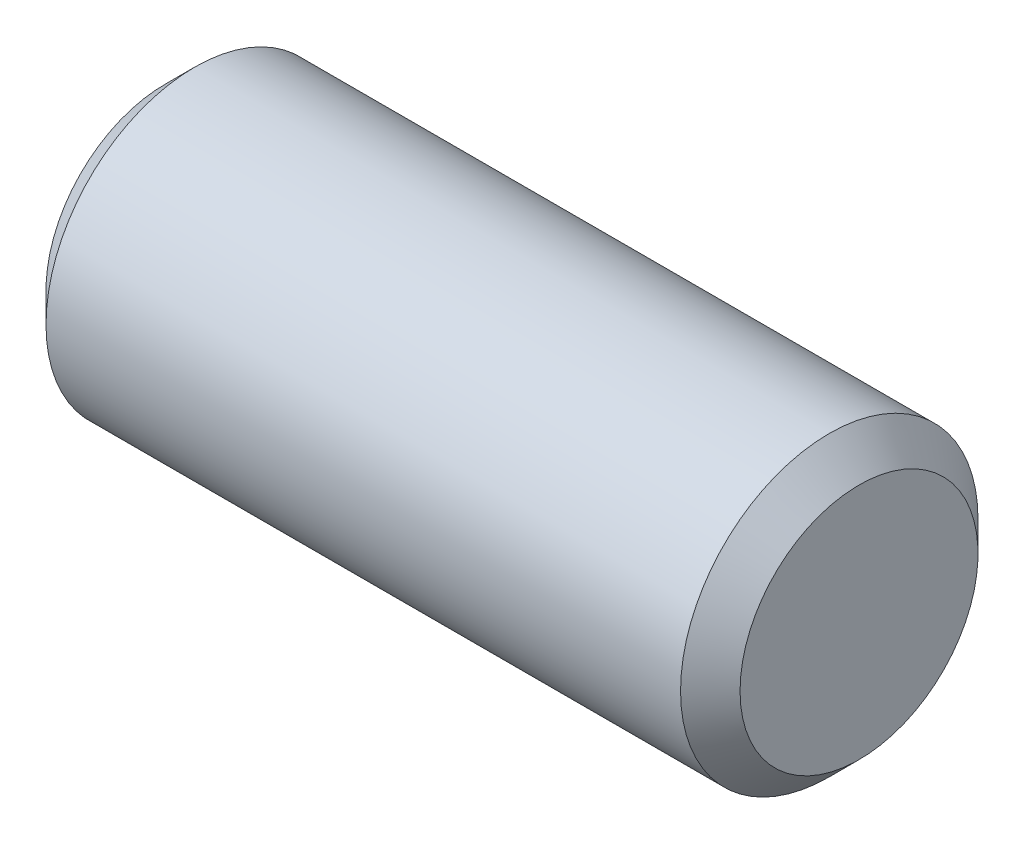
ISO-10303-21;
HEADER;
FILE_DESCRIPTION(('STEP AP214'),'2;1');
FILE_NAME('part.step','',(''),(''),'','','');
FILE_SCHEMA(('AUTOMOTIVE_DESIGN { 1 0 10303 214 1 1 1 1 }'));
ENDSEC;
DATA;
#1=APPLICATION_CONTEXT('core data for automotive mechanical design processes');
#2=APPLICATION_PROTOCOL_DEFINITION('international standard','automotive_design',2000,#1);
#3=PRODUCT_CONTEXT('',#1,'mechanical');
#4=PRODUCT('Part','Part','',(#3));
#5=PRODUCT_RELATED_PRODUCT_CATEGORY('part','',(#4));
#6=PRODUCT_DEFINITION_FORMATION('','',#4);
#7=PRODUCT_DEFINITION_CONTEXT('part definition',#1,'design');
#8=PRODUCT_DEFINITION('design','',#6,#7);
#9=PRODUCT_DEFINITION_SHAPE('','',#8);
#10=(LENGTH_UNIT() NAMED_UNIT(*) SI_UNIT(.MILLI.,.METRE.));
#11=(NAMED_UNIT(*) PLANE_ANGLE_UNIT() SI_UNIT($,.RADIAN.));
#12=(NAMED_UNIT(*) SI_UNIT($,.STERADIAN.) SOLID_ANGLE_UNIT());
#13=UNCERTAINTY_MEASURE_WITH_UNIT(LENGTH_MEASURE(1.E-05),#10,'distance_accuracy_value','');
#14=(GEOMETRIC_REPRESENTATION_CONTEXT(3) GLOBAL_UNCERTAINTY_ASSIGNED_CONTEXT((#13)) GLOBAL_UNIT_ASSIGNED_CONTEXT((#10,
#11,#12)) REPRESENTATION_CONTEXT('',''));
#15=CARTESIAN_POINT('',(0.,0.,0.));
#16=DIRECTION('',(0.,0.,1.));
#17=DIRECTION('',(1.,0.,0.));
#18=AXIS2_PLACEMENT_3D('',#15,#16,#17);
#19=CARTESIAN_POINT('',(-5.55625,0.,0.));
#20=DIRECTION('',(1.,0.,0.));
#21=DIRECTION('',(0.,0.,-1.));
#22=AXIS2_PLACEMENT_3D('',#19,#20,#21);
#23=CYLINDRICAL_SURFACE('',#22,2.38125);
#24=CARTESIAN_POINT('',(5.08,0.,0.));
#25=DIRECTION('',(1.,0.,0.));
#26=DIRECTION('',(0.,0.,-1.));
#27=AXIS2_PLACEMENT_3D('',#24,#25,#26);
#28=CIRCLE('',#27,2.38125);
#29=CARTESIAN_POINT('',(5.08,0.,2.38125));
#30=VERTEX_POINT('',#29);
#31=EDGE_CURVE('E42',#30,#30,#28,.F.);
#32=ORIENTED_EDGE('',*,*,#31,.T.);
#33=EDGE_LOOP('',(#32));
#34=FACE_BOUND('',#33,.T.);
#35=CARTESIAN_POINT('',(-5.08,0.,0.));
#36=DIRECTION('',(1.,0.,0.));
#37=DIRECTION('',(0.,0.,-1.));
#38=AXIS2_PLACEMENT_3D('',#35,#36,#37);
#39=CIRCLE('',#38,2.38125);
#40=CARTESIAN_POINT('',(-5.08,0.,-2.38125));
#41=VERTEX_POINT('',#40);
#42=EDGE_CURVE('E49',#41,#41,#39,.T.);
#43=ORIENTED_EDGE('',*,*,#42,.T.);
#44=EDGE_LOOP('',(#43));
#45=FACE_BOUND('',#44,.T.);
#46=ADVANCED_FACE('F34',(#34,#45),#23,.T.);
#47=CARTESIAN_POINT('',(-5.55625,0.,0.));
#48=DIRECTION('',(1.,0.,0.));
#49=DIRECTION('',(0.,0.,-1.));
#50=AXIS2_PLACEMENT_3D('',#47,#48,#49);
#51=PLANE('',#50);
#52=CARTESIAN_POINT('',(-5.55625,0.,0.));
#53=DIRECTION('',(1.,0.,0.));
#54=DIRECTION('',(0.,0.,-1.));
#55=AXIS2_PLACEMENT_3D('',#52,#53,#54);
#56=CIRCLE('',#55,1.905);
#57=CARTESIAN_POINT('',(-5.55625,0.,-1.905));
#58=VERTEX_POINT('',#57);
#59=EDGE_CURVE('E10',#58,#58,#56,.F.);
#60=ORIENTED_EDGE('',*,*,#59,.T.);
#61=EDGE_LOOP('',(#60));
#62=FACE_BOUND('',#61,.T.);
#63=ADVANCED_FACE('F69',(#62),#51,.F.);
#64=CARTESIAN_POINT('',(5.55625,0.,0.));
#65=DIRECTION('',(1.,0.,0.));
#66=DIRECTION('',(0.,0.,-1.));
#67=AXIS2_PLACEMENT_3D('',#64,#65,#66);
#68=PLANE('',#67);
#69=CARTESIAN_POINT('',(5.55625,0.,0.));
#70=DIRECTION('',(1.,0.,0.));
#71=DIRECTION('',(0.,0.,-1.));
#72=AXIS2_PLACEMENT_3D('',#69,#70,#71);
#73=CIRCLE('',#72,1.905);
#74=CARTESIAN_POINT('',(5.55625,0.,1.905));
#75=VERTEX_POINT('',#74);
#76=EDGE_CURVE('E53',#75,#75,#73,.T.);
#77=ORIENTED_EDGE('',*,*,#76,.T.);
#78=EDGE_LOOP('',(#77));
#79=FACE_BOUND('',#78,.T.);
#80=ADVANCED_FACE('F59',(#79),#68,.T.);
#81=CARTESIAN_POINT('',(5.55625,0.,0.));
#82=DIRECTION('',(-1.,0.,0.));
#83=DIRECTION('',(0.,0.,1.));
#84=AXIS2_PLACEMENT_3D('',#81,#82,#83);
#85=CONICAL_SURFACE('',#84,1.905,0.785398163397445);
#86=CARTESIAN_POINT('',(5.08,0.,2.38125));
#87=CARTESIAN_POINT('',(5.0849609375,0.,2.3762890625));
#88=CARTESIAN_POINT('',(5.089921875,0.,2.371328125));
#89=CARTESIAN_POINT('',(5.09984375,0.,2.36140625));
#90=CARTESIAN_POINT('',(5.1048046875,0.,2.3564453125));
#91=CARTESIAN_POINT('',(5.1147265625,0.,2.3465234375));
#92=CARTESIAN_POINT('',(5.1196875,0.,2.3415625));
#93=CARTESIAN_POINT('',(5.129609375,0.,2.331640625));
#94=CARTESIAN_POINT('',(5.1345703125,0.,2.3266796875));
#95=CARTESIAN_POINT('',(5.1444921875,0.,2.3167578125));
#96=CARTESIAN_POINT('',(5.149453125,0.,2.311796875));
#97=CARTESIAN_POINT('',(5.159375,0.,2.301875));
#98=CARTESIAN_POINT('',(5.1643359375,0.,2.2969140625));
#99=CARTESIAN_POINT('',(5.1742578125,0.,2.2869921875));
#100=CARTESIAN_POINT('',(5.17921875,0.,2.28203125));
#101=CARTESIAN_POINT('',(5.189140625,0.,2.272109375));
#102=CARTESIAN_POINT('',(5.1941015625,0.,2.2671484375));
#103=CARTESIAN_POINT('',(5.2040234375,0.,2.2572265625));
#104=CARTESIAN_POINT('',(5.208984375,0.,2.252265625));
#105=CARTESIAN_POINT('',(5.21890625,0.,2.24234375));
#106=CARTESIAN_POINT('',(5.2238671875,0.,2.2373828125));
#107=CARTESIAN_POINT('',(5.2337890625,0.,2.2274609375));
#108=CARTESIAN_POINT('',(5.23875,0.,2.2225));
#109=CARTESIAN_POINT('',(5.248671875,0.,2.212578125));
#110=CARTESIAN_POINT('',(5.2536328125,0.,2.2076171875));
#111=CARTESIAN_POINT('',(5.2635546875,0.,2.1976953125));
#112=CARTESIAN_POINT('',(5.268515625,0.,2.192734375));
#113=CARTESIAN_POINT('',(5.2784375,0.,2.1828125));
#114=CARTESIAN_POINT('',(5.2833984375,0.,2.1778515625));
#115=CARTESIAN_POINT('',(5.2933203125,0.,2.1679296875));
#116=CARTESIAN_POINT('',(5.29828125,0.,2.16296875));
#117=CARTESIAN_POINT('',(5.308203125,0.,2.153046875));
#118=CARTESIAN_POINT('',(5.3131640625,0.,2.1480859375));
#119=CARTESIAN_POINT('',(5.3230859375,0.,2.1381640625));
#120=CARTESIAN_POINT('',(5.328046875,0.,2.133203125));
#121=CARTESIAN_POINT('',(5.33796875,0.,2.12328125));
#122=CARTESIAN_POINT('',(5.3429296875,0.,2.1183203125));
#123=CARTESIAN_POINT('',(5.3528515625,0.,2.1083984375));
#124=CARTESIAN_POINT('',(5.3578125,0.,2.1034375));
#125=CARTESIAN_POINT('',(5.367734375,0.,2.093515625));
#126=CARTESIAN_POINT('',(5.3726953125,0.,2.0885546875));
#127=CARTESIAN_POINT('',(5.3826171875,0.,2.0786328125));
#128=CARTESIAN_POINT('',(5.387578125,0.,2.073671875));
#129=CARTESIAN_POINT('',(5.3975,0.,2.06375));
#130=CARTESIAN_POINT('',(5.4024609375,0.,2.0587890625));
#131=CARTESIAN_POINT('',(5.4123828125,0.,2.0488671875));
#132=CARTESIAN_POINT('',(5.41734375,0.,2.04390625));
#133=CARTESIAN_POINT('',(5.427265625,0.,2.033984375));
#134=CARTESIAN_POINT('',(5.4322265625,0.,2.0290234375));
#135=CARTESIAN_POINT('',(5.4421484375,0.,2.0191015625));
#136=CARTESIAN_POINT('',(5.447109375,0.,2.014140625));
#137=CARTESIAN_POINT('',(5.45703125,0.,2.00421875));
#138=CARTESIAN_POINT('',(5.4619921875,0.,1.9992578125));
#139=CARTESIAN_POINT('',(5.4719140625,0.,1.9893359375));
#140=CARTESIAN_POINT('',(5.476875,0.,1.984375));
#141=CARTESIAN_POINT('',(5.486796875,0.,1.974453125));
#142=CARTESIAN_POINT('',(5.4917578125,0.,1.9694921875));
#143=CARTESIAN_POINT('',(5.5016796875,0.,1.9595703125));
#144=CARTESIAN_POINT('',(5.506640625,0.,1.954609375));
#145=CARTESIAN_POINT('',(5.5165625,0.,1.9446875));
#146=CARTESIAN_POINT('',(5.5215234375,0.,1.9397265625));
#147=CARTESIAN_POINT('',(5.5314453125,0.,1.9298046875));
#148=CARTESIAN_POINT('',(5.53640625,0.,1.92484375));
#149=CARTESIAN_POINT('',(5.546328125,0.,1.914921875));
#150=CARTESIAN_POINT('',(5.5512890625,0.,1.9099609375));
#151=CARTESIAN_POINT('',(5.55625,0.,1.905));
#152=B_SPLINE_CURVE_WITH_KNOTS('',3,(#86,#87,#88,#89,#90,#91,#92,#93,#94,#95,#96,#97,#98,#99,
#100,#101,#102,#103,#104,#105,#106,#107,#108,#109,#110,#111,#112,#113,#114,#115,#116,#117,#118,
#119,#120,#121,#122,#123,#124,#125,#126,#127,#128,#129,#130,#131,#132,#133,#134,#135,#136,#137,
#138,#139,#140,#141,#142,#143,#144,#145,#146,#147,#148,#149,#150,#151),.UNSPECIFIED.,.F.,.F.,(4,
2,2,2,2,2,2,2,2,2,2,2,2,2,2,2,2,2,2,2,2,2,2,2,2,2,2,2,2,2,2,2,4),(0.,0.021047475283756,
0.042094950567512,0.0631424258512675,0.0841899011350235,0.10523737641878,0.126284851702535,
0.147332326986291,0.168379802270046,0.189427277553802,0.210474752837558,0.231522228121314,
0.25256970340507,0.273617178688826,0.294664653972581,0.315712129256337,0.336759604540093,
0.357807079823849,0.378854555107605,0.39990203039136,0.420949505675116,0.441996980958873,
0.463044456242628,0.484091931526384,0.50513940681014,0.526186882093895,0.547234357377651,
0.568281832661407,0.589329307945163,0.610376783228919,0.631424258512674,0.65247173379643,
0.673519209080186),.UNSPECIFIED.);
#153=EDGE_CURVE('BSEAM61',#30,#75,#152,.T.);
#154=ORIENTED_EDGE('',*,*,#31,.F.);
#155=ORIENTED_EDGE('',*,*,#76,.F.);
#156=ORIENTED_EDGE('',*,*,#153,.T.);
#157=ORIENTED_EDGE('',*,*,#153,.F.);
#158=EDGE_LOOP('',(#154,#156,#155,#157));
#159=FACE_BOUND('',#158,.T.);
#160=ADVANCED_FACE('F61',(#159),#85,.T.);
#161=CARTESIAN_POINT('',(-5.08,0.,0.));
#162=DIRECTION('',(1.,0.,0.));
#163=DIRECTION('',(0.,0.,-1.));
#164=AXIS2_PLACEMENT_3D('',#161,#162,#163);
#165=CONICAL_SURFACE('',#164,2.38125,0.785398163397451);
#166=ORIENTED_EDGE('',*,*,#59,.F.);
#167=EDGE_LOOP('',(#166));
#168=FACE_BOUND('',#167,.T.);
#169=ORIENTED_EDGE('',*,*,#42,.F.);
#170=EDGE_LOOP('',(#169));
#171=FACE_BOUND('',#170,.T.);
#172=ADVANCED_FACE('F36',(#168,#171),#165,.T.);
#173=CLOSED_SHELL('',(#46,#63,#80,#160,#172));
#174=MANIFOLD_SOLID_BREP('B2',#173);
#175=ADVANCED_BREP_SHAPE_REPRESENTATION('',(#18,#174),#14);
#176=SHAPE_DEFINITION_REPRESENTATION(#9,#175);
ENDSEC;
END-ISO-10303-21;
